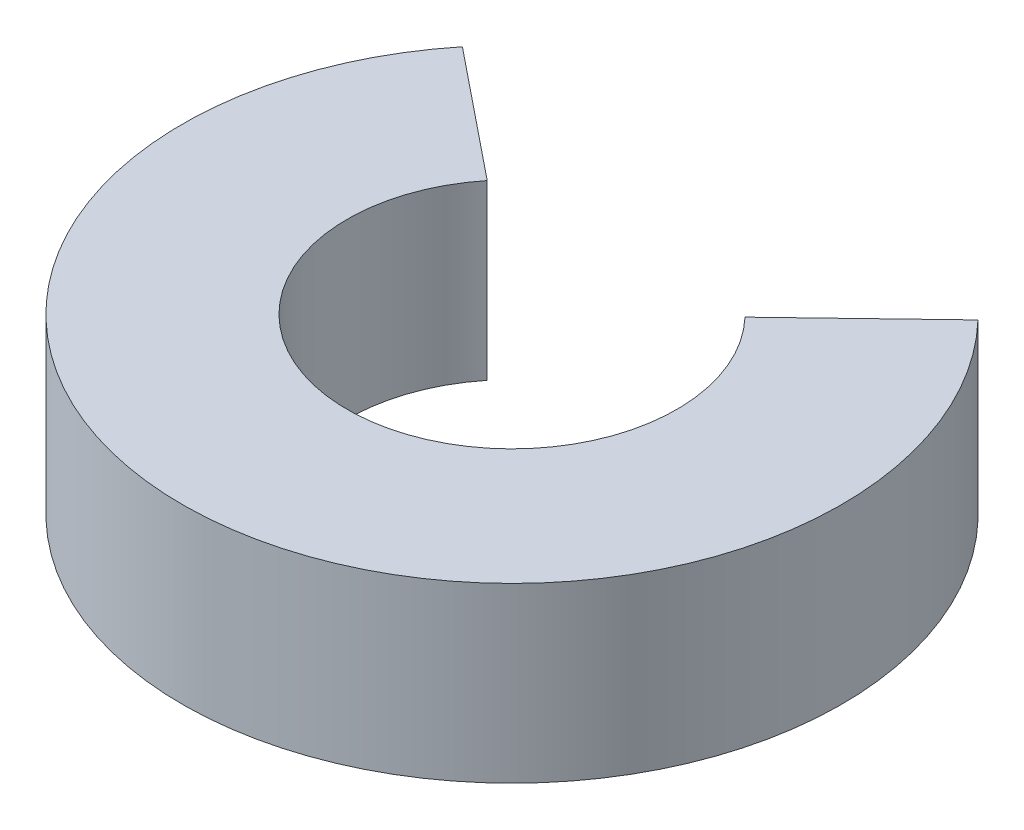
ISO-10303-21;
HEADER;
FILE_DESCRIPTION(('STEP AP214'),'2;1');
FILE_NAME('part.step','',(''),(''),'','','');
FILE_SCHEMA(('AUTOMOTIVE_DESIGN { 1 0 10303 214 1 1 1 1 }'));
ENDSEC;
DATA;
#1=APPLICATION_CONTEXT('core data for automotive mechanical design processes');
#2=APPLICATION_PROTOCOL_DEFINITION('international standard','automotive_design',2000,#1);
#3=PRODUCT_CONTEXT('',#1,'mechanical');
#4=PRODUCT('Part','Part','',(#3));
#5=PRODUCT_RELATED_PRODUCT_CATEGORY('part','',(#4));
#6=PRODUCT_DEFINITION_FORMATION('','',#4);
#7=PRODUCT_DEFINITION_CONTEXT('part definition',#1,'design');
#8=PRODUCT_DEFINITION('design','',#6,#7);
#9=PRODUCT_DEFINITION_SHAPE('','',#8);
#10=(LENGTH_UNIT() NAMED_UNIT(*) SI_UNIT(.MILLI.,.METRE.));
#11=(NAMED_UNIT(*) PLANE_ANGLE_UNIT() SI_UNIT($,.RADIAN.));
#12=(NAMED_UNIT(*) SI_UNIT($,.STERADIAN.) SOLID_ANGLE_UNIT());
#13=UNCERTAINTY_MEASURE_WITH_UNIT(LENGTH_MEASURE(1.E-05),#10,'distance_accuracy_value','');
#14=(GEOMETRIC_REPRESENTATION_CONTEXT(3) GLOBAL_UNCERTAINTY_ASSIGNED_CONTEXT((#13)) GLOBAL_UNIT_ASSIGNED_CONTEXT((#10,
#11,#12)) REPRESENTATION_CONTEXT('',''));
#15=CARTESIAN_POINT('',(0.,0.,0.));
#16=DIRECTION('',(0.,0.,1.));
#17=DIRECTION('',(1.,0.,0.));
#18=AXIS2_PLACEMENT_3D('',#15,#16,#17);
#19=CARTESIAN_POINT('',(0.,4.2,0.));
#20=DIRECTION('',(0.,-1.,0.));
#21=DIRECTION('',(0.,0.,-1.));
#22=AXIS2_PLACEMENT_3D('',#19,#20,#21);
#23=CYLINDRICAL_SURFACE('',#22,8.);
#24=CARTESIAN_POINT('',(0.,0.,0.));
#25=DIRECTION('',(0.,1.,0.));
#26=DIRECTION('',(0.,0.,1.));
#27=AXIS2_PLACEMENT_3D('',#24,#25,#26);
#28=CIRCLE('',#27,8.);
#29=CARTESIAN_POINT('',(-6.22678120950116,0.,-5.02266819220653));
#30=VERTEX_POINT('',#29);
#31=CARTESIAN_POINT('',(5.77321879049884,0.,-5.5380452144264));
#32=VERTEX_POINT('',#31);
#33=EDGE_CURVE('E96',#30,#32,#28,.T.);
#34=ORIENTED_EDGE('',*,*,#33,.T.);
#35=DIRECTION('',(0.,-1.,0.));
#36=VECTOR('',#35,1.);
#37=CARTESIAN_POINT('',(5.77321879049884,4.2,-5.5380452144264));
#38=LINE('',#37,#36);
#39=CARTESIAN_POINT('',(5.77321879049884,4.2,-5.5380452144264));
#40=VERTEX_POINT('',#39);
#41=EDGE_CURVE('E11',#40,#32,#38,.T.);
#42=ORIENTED_EDGE('',*,*,#41,.F.);
#43=CARTESIAN_POINT('',(0.,4.2,0.));
#44=DIRECTION('',(0.,1.,0.));
#45=DIRECTION('',(0.,0.,1.));
#46=AXIS2_PLACEMENT_3D('',#43,#44,#45);
#47=CIRCLE('',#46,8.);
#48=CARTESIAN_POINT('',(-6.22678120950116,4.2,-5.02266819220653));
#49=VERTEX_POINT('',#48);
#50=EDGE_CURVE('E84',#49,#40,#47,.T.);
#51=ORIENTED_EDGE('',*,*,#50,.F.);
#52=DIRECTION('',(0.,-1.,0.));
#53=VECTOR('',#52,1.);
#54=CARTESIAN_POINT('',(-6.22678120950116,4.2,-5.02266819220653));
#55=LINE('',#54,#53);
#56=EDGE_CURVE('E92',#49,#30,#55,.T.);
#57=ORIENTED_EDGE('',*,*,#56,.T.);
#58=EDGE_LOOP('',(#34,#42,#51,#57));
#59=FACE_BOUND('',#58,.T.);
#60=ADVANCED_FACE('F33',(#59),#23,.T.);
#61=CARTESIAN_POINT('',(2.88660939524942,4.2,-2.7690226072132));
#62=DIRECTION('',(0.6922556518033,0.,0.721652348812355));
#63=DIRECTION('',(0.721652348812355,0.,-0.6922556518033));
#64=AXIS2_PLACEMENT_3D('',#61,#62,#63);
#65=PLANE('',#64);
#66=DIRECTION('',(-0.721652348812355,0.,0.6922556518033));
#67=VECTOR('',#66,1.);
#68=CARTESIAN_POINT('',(2.88660939524942,0.,-2.7690226072132));
#69=LINE('',#68,#67);
#70=CARTESIAN_POINT('',(2.88660939524942,0.,-2.7690226072132));
#71=VERTEX_POINT('',#70);
#72=EDGE_CURVE('E88',#32,#71,#69,.T.);
#73=ORIENTED_EDGE('',*,*,#72,.T.);
#74=DIRECTION('',(0.,-1.,0.));
#75=VECTOR('',#74,1.);
#76=CARTESIAN_POINT('',(2.88660939524942,4.2,-2.7690226072132));
#77=LINE('',#76,#75);
#78=CARTESIAN_POINT('',(2.88660939524942,4.2,-2.7690226072132));
#79=VERTEX_POINT('',#78);
#80=EDGE_CURVE('E41',#79,#71,#77,.T.);
#81=ORIENTED_EDGE('',*,*,#80,.F.);
#82=DIRECTION('',(-0.721652348812355,0.,0.6922556518033));
#83=VECTOR('',#82,1.);
#84=CARTESIAN_POINT('',(2.88660939524942,4.2,-2.7690226072132));
#85=LINE('',#84,#83);
#86=EDGE_CURVE('E79',#40,#79,#85,.T.);
#87=ORIENTED_EDGE('',*,*,#86,.F.);
#88=ORIENTED_EDGE('',*,*,#41,.T.);
#89=EDGE_LOOP('',(#73,#81,#87,#88));
#90=FACE_BOUND('',#89,.T.);
#91=ADVANCED_FACE('F87',(#90),#65,.F.);
#92=CARTESIAN_POINT('',(0.,4.2,0.));
#93=DIRECTION('',(0.,-1.,0.));
#94=DIRECTION('',(0.,0.,-1.));
#95=AXIS2_PLACEMENT_3D('',#92,#93,#94);
#96=CYLINDRICAL_SURFACE('',#95,4.);
#97=CARTESIAN_POINT('',(0.,0.,0.));
#98=DIRECTION('',(0.,-1.,0.));
#99=DIRECTION('',(0.,0.,1.));
#100=AXIS2_PLACEMENT_3D('',#97,#98,#99);
#101=CIRCLE('',#100,4.);
#102=CARTESIAN_POINT('',(-3.11339060475058,0.,-2.51133409610327));
#103=VERTEX_POINT('',#102);
#104=EDGE_CURVE('E66',#71,#103,#101,.T.);
#105=ORIENTED_EDGE('',*,*,#104,.T.);
#106=DIRECTION('',(0.,-1.,0.));
#107=VECTOR('',#106,1.);
#108=CARTESIAN_POINT('',(-3.11339060475058,4.2,-2.51133409610327));
#109=LINE('',#108,#107);
#110=CARTESIAN_POINT('',(-3.11339060475058,4.2,-2.51133409610327));
#111=VERTEX_POINT('',#110);
#112=EDGE_CURVE('E89',#111,#103,#109,.T.);
#113=ORIENTED_EDGE('',*,*,#112,.F.);
#114=CARTESIAN_POINT('',(0.,4.2,0.));
#115=DIRECTION('',(0.,-1.,0.));
#116=DIRECTION('',(0.,0.,1.));
#117=AXIS2_PLACEMENT_3D('',#114,#115,#116);
#118=CIRCLE('',#117,4.);
#119=EDGE_CURVE('E82',#79,#111,#118,.T.);
#120=ORIENTED_EDGE('',*,*,#119,.F.);
#121=ORIENTED_EDGE('',*,*,#80,.T.);
#122=EDGE_LOOP('',(#105,#113,#120,#121));
#123=FACE_BOUND('',#122,.T.);
#124=ADVANCED_FACE('F90',(#123),#96,.F.);
#125=CARTESIAN_POINT('',(-6.22678120950116,4.2,-5.02266819220653));
#126=DIRECTION('',(-0.627833524025816,0.,0.778347651187646));
#127=DIRECTION('',(0.778347651187645,0.,0.627833524025816));
#128=AXIS2_PLACEMENT_3D('',#125,#126,#127);
#129=PLANE('',#128);
#130=DIRECTION('',(-0.778347651187645,0.,-0.627833524025816));
#131=VECTOR('',#130,1.);
#132=CARTESIAN_POINT('',(-6.22678120950116,0.,-5.02266819220653));
#133=LINE('',#132,#131);
#134=EDGE_CURVE('E72',#103,#30,#133,.T.);
#135=ORIENTED_EDGE('',*,*,#134,.T.);
#136=ORIENTED_EDGE('',*,*,#56,.F.);
#137=DIRECTION('',(-0.778347651187645,0.,-0.627833524025816));
#138=VECTOR('',#137,1.);
#139=CARTESIAN_POINT('',(-6.22678120950116,4.2,-5.02266819220653));
#140=LINE('',#139,#138);
#141=EDGE_CURVE('E49',#111,#49,#140,.T.);
#142=ORIENTED_EDGE('',*,*,#141,.F.);
#143=ORIENTED_EDGE('',*,*,#112,.T.);
#144=EDGE_LOOP('',(#135,#136,#142,#143));
#145=FACE_BOUND('',#144,.T.);
#146=ADVANCED_FACE('F103',(#145),#129,.F.);
#147=CARTESIAN_POINT('',(0.,4.2,0.));
#148=DIRECTION('',(0.,1.,0.));
#149=DIRECTION('',(0.,0.,1.));
#150=AXIS2_PLACEMENT_3D('',#147,#148,#149);
#151=PLANE('',#150);
#152=ORIENTED_EDGE('',*,*,#50,.T.);
#153=ORIENTED_EDGE('',*,*,#86,.T.);
#154=ORIENTED_EDGE('',*,*,#119,.T.);
#155=ORIENTED_EDGE('',*,*,#141,.T.);
#156=EDGE_LOOP('',(#152,#153,#154,#155));
#157=FACE_BOUND('',#156,.T.);
#158=ADVANCED_FACE('F80',(#157),#151,.T.);
#159=CARTESIAN_POINT('',(0.,0.,0.));
#160=DIRECTION('',(0.,1.,0.));
#161=DIRECTION('',(0.,0.,1.));
#162=AXIS2_PLACEMENT_3D('',#159,#160,#161);
#163=PLANE('',#162);
#164=ORIENTED_EDGE('',*,*,#33,.F.);
#165=ORIENTED_EDGE('',*,*,#134,.F.);
#166=ORIENTED_EDGE('',*,*,#104,.F.);
#167=ORIENTED_EDGE('',*,*,#72,.F.);
#168=EDGE_LOOP('',(#164,#165,#166,#167));
#169=FACE_BOUND('',#168,.T.);
#170=ADVANCED_FACE('F106',(#169),#163,.F.);
#171=CLOSED_SHELL('',(#60,#91,#124,#146,#158,#170));
#172=MANIFOLD_SOLID_BREP('B2',#171);
#173=ADVANCED_BREP_SHAPE_REPRESENTATION('',(#18,#172),#14);
#174=SHAPE_DEFINITION_REPRESENTATION(#9,#173);
ENDSEC;
END-ISO-10303-21;
